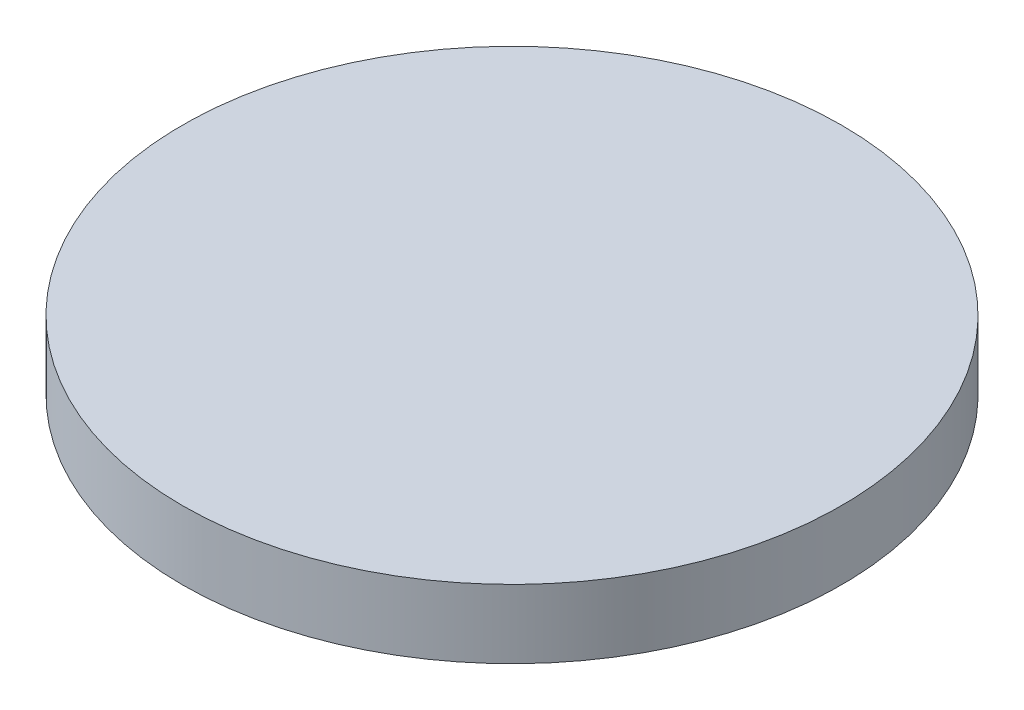
ISO-10303-21;
HEADER;
FILE_DESCRIPTION(('STEP AP214'),'2;1');
FILE_NAME('part.step','',(''),(''),'','','');
FILE_SCHEMA(('AUTOMOTIVE_DESIGN { 1 0 10303 214 1 1 1 1 }'));
ENDSEC;
DATA;
#1=APPLICATION_CONTEXT('core data for automotive mechanical design processes');
#2=APPLICATION_PROTOCOL_DEFINITION('international standard','automotive_design',2000,#1);
#3=PRODUCT_CONTEXT('',#1,'mechanical');
#4=PRODUCT('Part','Part','',(#3));
#5=PRODUCT_RELATED_PRODUCT_CATEGORY('part','',(#4));
#6=PRODUCT_DEFINITION_FORMATION('','',#4);
#7=PRODUCT_DEFINITION_CONTEXT('part definition',#1,'design');
#8=PRODUCT_DEFINITION('design','',#6,#7);
#9=PRODUCT_DEFINITION_SHAPE('','',#8);
#10=(LENGTH_UNIT() NAMED_UNIT(*) SI_UNIT(.MILLI.,.METRE.));
#11=(NAMED_UNIT(*) PLANE_ANGLE_UNIT() SI_UNIT($,.RADIAN.));
#12=(NAMED_UNIT(*) SI_UNIT($,.STERADIAN.) SOLID_ANGLE_UNIT());
#13=UNCERTAINTY_MEASURE_WITH_UNIT(LENGTH_MEASURE(1.E-05),#10,'distance_accuracy_value','');
#14=(GEOMETRIC_REPRESENTATION_CONTEXT(3) GLOBAL_UNCERTAINTY_ASSIGNED_CONTEXT((#13)) GLOBAL_UNIT_ASSIGNED_CONTEXT((#10,
#11,#12)) REPRESENTATION_CONTEXT('',''));
#15=CARTESIAN_POINT('',(0.,0.,0.));
#16=DIRECTION('',(0.,0.,1.));
#17=DIRECTION('',(1.,0.,0.));
#18=AXIS2_PLACEMENT_3D('',#15,#16,#17);
#19=CARTESIAN_POINT('',(0.,2.5,0.));
#20=DIRECTION('',(0.,-1.,0.));
#21=DIRECTION('',(0.,0.,-1.));
#22=AXIS2_PLACEMENT_3D('',#19,#20,#21);
#23=CYLINDRICAL_SURFACE('',#22,12.);
#24=CARTESIAN_POINT('',(0.,2.5,0.));
#25=DIRECTION('',(0.,1.,0.));
#26=DIRECTION('',(0.,0.,1.));
#27=AXIS2_PLACEMENT_3D('',#24,#25,#26);
#28=CIRCLE('',#27,12.);
#29=CARTESIAN_POINT('',(0.,2.5,12.));
#30=VERTEX_POINT('',#29);
#31=EDGE_CURVE('E10',#30,#30,#28,.T.);
#32=ORIENTED_EDGE('',*,*,#31,.F.);
#33=EDGE_LOOP('',(#32));
#34=FACE_BOUND('',#33,.T.);
#35=CARTESIAN_POINT('',(0.,0.,0.));
#36=DIRECTION('',(0.,1.,0.));
#37=DIRECTION('',(0.,0.,1.));
#38=AXIS2_PLACEMENT_3D('',#35,#36,#37);
#39=CIRCLE('',#38,12.);
#40=CARTESIAN_POINT('',(0.,0.,12.));
#41=VERTEX_POINT('',#40);
#42=EDGE_CURVE('E44',#41,#41,#39,.T.);
#43=ORIENTED_EDGE('',*,*,#42,.T.);
#44=EDGE_LOOP('',(#43));
#45=FACE_BOUND('',#44,.T.);
#46=ADVANCED_FACE('F41',(#34,#45),#23,.T.);
#47=CARTESIAN_POINT('',(0.,2.5,0.));
#48=DIRECTION('',(0.,1.,0.));
#49=DIRECTION('',(0.,0.,1.));
#50=AXIS2_PLACEMENT_3D('',#47,#48,#49);
#51=PLANE('',#50);
#52=ORIENTED_EDGE('',*,*,#31,.T.);
#53=EDGE_LOOP('',(#52));
#54=FACE_BOUND('',#53,.T.);
#55=ADVANCED_FACE('F58',(#54),#51,.T.);
#56=CARTESIAN_POINT('',(0.,0.,0.));
#57=DIRECTION('',(0.,1.,0.));
#58=DIRECTION('',(0.,0.,1.));
#59=AXIS2_PLACEMENT_3D('',#56,#57,#58);
#60=PLANE('',#59);
#61=ORIENTED_EDGE('',*,*,#42,.F.);
#62=EDGE_LOOP('',(#61));
#63=FACE_BOUND('',#62,.T.);
#64=ADVANCED_FACE('F56',(#63),#60,.F.);
#65=CLOSED_SHELL('',(#46,#55,#64));
#66=MANIFOLD_SOLID_BREP('B2',#65);
#67=ADVANCED_BREP_SHAPE_REPRESENTATION('',(#18,#66),#14);
#68=SHAPE_DEFINITION_REPRESENTATION(#9,#67);
ENDSEC;
END-ISO-10303-21;
